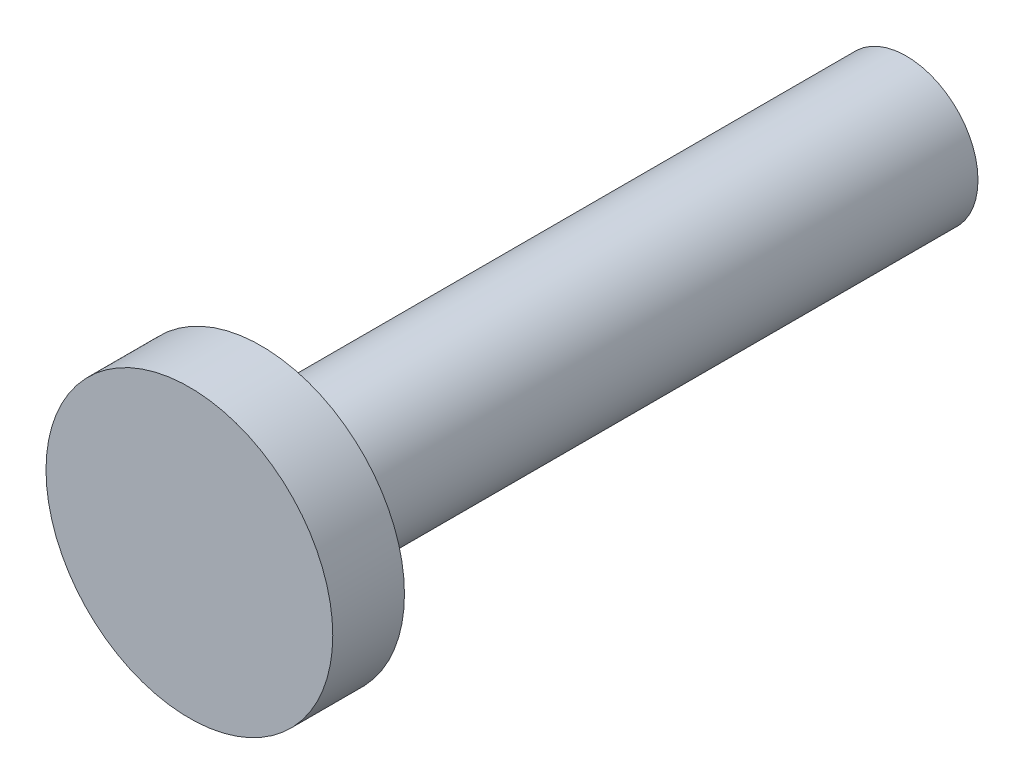
ISO-10303-21;
HEADER;
FILE_DESCRIPTION(('STEP AP214'),'2;1');
FILE_NAME('part.step','',(''),(''),'','','');
FILE_SCHEMA(('AUTOMOTIVE_DESIGN { 1 0 10303 214 1 1 1 1 }'));
ENDSEC;
DATA;
#1=APPLICATION_CONTEXT('core data for automotive mechanical design processes');
#2=APPLICATION_PROTOCOL_DEFINITION('international standard','automotive_design',2000,#1);
#3=PRODUCT_CONTEXT('',#1,'mechanical');
#4=PRODUCT('Part','Part','',(#3));
#5=PRODUCT_RELATED_PRODUCT_CATEGORY('part','',(#4));
#6=PRODUCT_DEFINITION_FORMATION('','',#4);
#7=PRODUCT_DEFINITION_CONTEXT('part definition',#1,'design');
#8=PRODUCT_DEFINITION('design','',#6,#7);
#9=PRODUCT_DEFINITION_SHAPE('','',#8);
#10=(LENGTH_UNIT() NAMED_UNIT(*) SI_UNIT(.MILLI.,.METRE.));
#11=(NAMED_UNIT(*) PLANE_ANGLE_UNIT() SI_UNIT($,.RADIAN.));
#12=(NAMED_UNIT(*) SI_UNIT($,.STERADIAN.) SOLID_ANGLE_UNIT());
#13=UNCERTAINTY_MEASURE_WITH_UNIT(LENGTH_MEASURE(1.E-05),#10,'distance_accuracy_value','');
#14=(GEOMETRIC_REPRESENTATION_CONTEXT(3) GLOBAL_UNCERTAINTY_ASSIGNED_CONTEXT((#13)) GLOBAL_UNIT_ASSIGNED_CONTEXT((#10,
#11,#12)) REPRESENTATION_CONTEXT('',''));
#15=CARTESIAN_POINT('',(0.,0.,0.));
#16=DIRECTION('',(0.,0.,1.));
#17=DIRECTION('',(1.,0.,0.));
#18=AXIS2_PLACEMENT_3D('',#15,#16,#17);
#19=CARTESIAN_POINT('',(0.,0.,5.));
#20=DIRECTION('',(0.,0.,-1.));
#21=DIRECTION('',(-1.,0.,0.));
#22=AXIS2_PLACEMENT_3D('',#19,#20,#21);
#23=CYLINDRICAL_SURFACE('',#22,10.);
#24=CARTESIAN_POINT('',(0.,0.,5.));
#25=DIRECTION('',(0.,0.,1.));
#26=DIRECTION('',(1.,0.,0.));
#27=AXIS2_PLACEMENT_3D('',#24,#25,#26);
#28=CIRCLE('',#27,10.);
#29=CARTESIAN_POINT('',(10.,0.,5.));
#30=VERTEX_POINT('',#29);
#31=EDGE_CURVE('E38',#30,#30,#28,.T.);
#32=ORIENTED_EDGE('',*,*,#31,.F.);
#33=EDGE_LOOP('',(#32));
#34=FACE_BOUND('',#33,.T.);
#35=CARTESIAN_POINT('',(0.,0.,0.));
#36=DIRECTION('',(0.,0.,1.));
#37=DIRECTION('',(1.,0.,0.));
#38=AXIS2_PLACEMENT_3D('',#35,#36,#37);
#39=CIRCLE('',#38,10.);
#40=CARTESIAN_POINT('',(10.,0.,0.));
#41=VERTEX_POINT('',#40);
#42=EDGE_CURVE('E34',#41,#41,#39,.T.);
#43=ORIENTED_EDGE('',*,*,#42,.T.);
#44=EDGE_LOOP('',(#43));
#45=FACE_BOUND('',#44,.T.);
#46=ADVANCED_FACE('F31',(#34,#45),#23,.T.);
#47=CARTESIAN_POINT('',(0.,0.,5.));
#48=DIRECTION('',(0.,0.,1.));
#49=DIRECTION('',(1.,0.,0.));
#50=AXIS2_PLACEMENT_3D('',#47,#48,#49);
#51=PLANE('',#50);
#52=ORIENTED_EDGE('',*,*,#31,.T.);
#53=EDGE_LOOP('',(#52));
#54=FACE_BOUND('',#53,.T.);
#55=ADVANCED_FACE('F55',(#54),#51,.T.);
#56=CARTESIAN_POINT('',(0.,0.,0.));
#57=DIRECTION('',(0.,0.,1.));
#58=DIRECTION('',(1.,0.,0.));
#59=AXIS2_PLACEMENT_3D('',#56,#57,#58);
#60=PLANE('',#59);
#61=CARTESIAN_POINT('',(0.,0.,0.));
#62=DIRECTION('',(0.,0.,-1.));
#63=DIRECTION('',(-1.,0.,0.));
#64=AXIS2_PLACEMENT_3D('',#61,#62,#63);
#65=CIRCLE('',#64,5.);
#66=CARTESIAN_POINT('',(5.,0.,0.));
#67=VERTEX_POINT('',#66);
#68=EDGE_CURVE('E10',#67,#67,#65,.T.);
#69=ORIENTED_EDGE('',*,*,#68,.F.);
#70=EDGE_LOOP('',(#69));
#71=FACE_BOUND('',#70,.T.);
#72=ORIENTED_EDGE('',*,*,#42,.F.);
#73=EDGE_LOOP('',(#72));
#74=FACE_BOUND('',#73,.T.);
#75=ADVANCED_FACE('F52',(#71,#74),#60,.F.);
#76=CARTESIAN_POINT('',(0.,0.,-45.));
#77=DIRECTION('',(0.,0.,1.));
#78=DIRECTION('',(1.,0.,0.));
#79=AXIS2_PLACEMENT_3D('',#76,#77,#78);
#80=CYLINDRICAL_SURFACE('',#79,5.);
#81=CARTESIAN_POINT('',(0.,0.,-45.));
#82=DIRECTION('',(0.,0.,-1.));
#83=DIRECTION('',(-1.,0.,0.));
#84=AXIS2_PLACEMENT_3D('',#81,#82,#83);
#85=CIRCLE('',#84,5.);
#86=CARTESIAN_POINT('',(5.,0.,-45.));
#87=VERTEX_POINT('',#86);
#88=EDGE_CURVE('E44',#87,#87,#85,.T.);
#89=CARTESIAN_POINT('',(5.,0.,-45.));
#90=CARTESIAN_POINT('',(5.,0.,-44.53125));
#91=CARTESIAN_POINT('',(5.,0.,-44.0625));
#92=CARTESIAN_POINT('',(5.,0.,-43.125));
#93=CARTESIAN_POINT('',(5.,0.,-42.65625));
#94=CARTESIAN_POINT('',(5.,0.,-41.71875));
#95=CARTESIAN_POINT('',(5.,0.,-41.25));
#96=CARTESIAN_POINT('',(5.,0.,-40.3125));
#97=CARTESIAN_POINT('',(5.,0.,-39.84375));
#98=CARTESIAN_POINT('',(5.,0.,-38.90625));
#99=CARTESIAN_POINT('',(5.,0.,-38.4375));
#100=CARTESIAN_POINT('',(5.,0.,-37.5));
#101=CARTESIAN_POINT('',(5.,0.,-37.03125));
#102=CARTESIAN_POINT('',(5.,0.,-36.09375));
#103=CARTESIAN_POINT('',(5.,0.,-35.625));
#104=CARTESIAN_POINT('',(5.,0.,-34.6875));
#105=CARTESIAN_POINT('',(5.,0.,-34.21875));
#106=CARTESIAN_POINT('',(5.,0.,-33.28125));
#107=CARTESIAN_POINT('',(5.,0.,-32.8125));
#108=CARTESIAN_POINT('',(5.,0.,-31.875));
#109=CARTESIAN_POINT('',(5.,0.,-31.40625));
#110=CARTESIAN_POINT('',(5.,0.,-30.46875));
#111=CARTESIAN_POINT('',(5.,0.,-30.));
#112=CARTESIAN_POINT('',(5.,0.,-29.0625));
#113=CARTESIAN_POINT('',(5.,0.,-28.59375));
#114=CARTESIAN_POINT('',(5.,0.,-27.65625));
#115=CARTESIAN_POINT('',(5.,0.,-27.1875));
#116=CARTESIAN_POINT('',(5.,0.,-26.25));
#117=CARTESIAN_POINT('',(5.,0.,-25.78125));
#118=CARTESIAN_POINT('',(5.,0.,-24.84375));
#119=CARTESIAN_POINT('',(5.,0.,-24.375));
#120=CARTESIAN_POINT('',(5.,0.,-23.4375));
#121=CARTESIAN_POINT('',(5.,0.,-22.96875));
#122=CARTESIAN_POINT('',(5.,0.,-22.03125));
#123=CARTESIAN_POINT('',(5.,0.,-21.5625));
#124=CARTESIAN_POINT('',(5.,0.,-20.625));
#125=CARTESIAN_POINT('',(5.,0.,-20.15625));
#126=CARTESIAN_POINT('',(5.,0.,-19.21875));
#127=CARTESIAN_POINT('',(5.,0.,-18.75));
#128=CARTESIAN_POINT('',(5.,0.,-17.8125));
#129=CARTESIAN_POINT('',(5.,0.,-17.34375));
#130=CARTESIAN_POINT('',(5.,0.,-16.40625));
#131=CARTESIAN_POINT('',(5.,0.,-15.9375));
#132=CARTESIAN_POINT('',(5.,0.,-15.));
#133=CARTESIAN_POINT('',(5.,0.,-14.53125));
#134=CARTESIAN_POINT('',(5.,0.,-13.59375));
#135=CARTESIAN_POINT('',(5.,0.,-13.125));
#136=CARTESIAN_POINT('',(5.,0.,-12.1875));
#137=CARTESIAN_POINT('',(5.,0.,-11.71875));
#138=CARTESIAN_POINT('',(5.,0.,-10.78125));
#139=CARTESIAN_POINT('',(5.,0.,-10.3125));
#140=CARTESIAN_POINT('',(5.,0.,-9.375));
#141=CARTESIAN_POINT('',(5.,0.,-8.90625));
#142=CARTESIAN_POINT('',(5.,0.,-7.96875));
#143=CARTESIAN_POINT('',(5.,0.,-7.5));
#144=CARTESIAN_POINT('',(5.,0.,-6.5625));
#145=CARTESIAN_POINT('',(5.,0.,-6.09375));
#146=CARTESIAN_POINT('',(5.,0.,-5.15625));
#147=CARTESIAN_POINT('',(5.,0.,-4.6875));
#148=CARTESIAN_POINT('',(5.,0.,-3.75));
#149=CARTESIAN_POINT('',(5.,0.,-3.28125));
#150=CARTESIAN_POINT('',(5.,0.,-2.34375));
#151=CARTESIAN_POINT('',(5.,0.,-1.875));
#152=CARTESIAN_POINT('',(5.,0.,-0.937499999999999));
#153=CARTESIAN_POINT('',(5.,0.,-0.46875));
#154=CARTESIAN_POINT('',(5.,0.,0.));
#155=B_SPLINE_CURVE_WITH_KNOTS('',3,(#89,#90,#91,#92,#93,#94,#95,#96,#97,#98,#99,#100,#101,#102,
#103,#104,#105,#106,#107,#108,#109,#110,#111,#112,#113,#114,#115,#116,#117,#118,#119,#120,#121,
#122,#123,#124,#125,#126,#127,#128,#129,#130,#131,#132,#133,#134,#135,#136,#137,#138,#139,#140,
#141,#142,#143,#144,#145,#146,#147,#148,#149,#150,#151,#152,#153,#154),.UNSPECIFIED.,.F.,.F.,(4,
2,2,2,2,2,2,2,2,2,2,2,2,2,2,2,2,2,2,2,2,2,2,2,2,2,2,2,2,2,2,2,4),(0.,1.40625,2.8125,4.21875,
5.62500000000001,7.03125,8.43750000000001,9.84375000000001,11.25,12.65625,14.0625,15.46875,
16.875,18.28125,19.6875,21.09375,22.5,23.90625,25.3125,26.71875,28.125,29.53125,30.9375,
32.34375,33.75,35.15625,36.5625,37.96875,39.375,40.78125,42.1875,43.59375,45.),.UNSPECIFIED.);
#156=EDGE_CURVE('BSEAM54',#87,#67,#155,.T.);
#157=ORIENTED_EDGE('',*,*,#88,.F.);
#158=ORIENTED_EDGE('',*,*,#68,.T.);
#159=ORIENTED_EDGE('',*,*,#156,.T.);
#160=ORIENTED_EDGE('',*,*,#156,.F.);
#161=EDGE_LOOP('',(#157,#159,#158,#160));
#162=FACE_BOUND('',#161,.T.);
#163=ADVANCED_FACE('F54',(#162),#80,.T.);
#164=CARTESIAN_POINT('',(0.,0.,-45.));
#165=DIRECTION('',(0.,0.,-1.));
#166=DIRECTION('',(-1.,0.,0.));
#167=AXIS2_PLACEMENT_3D('',#164,#165,#166);
#168=PLANE('',#167);
#169=ORIENTED_EDGE('',*,*,#88,.T.);
#170=EDGE_LOOP('',(#169));
#171=FACE_BOUND('',#170,.T.);
#172=ADVANCED_FACE('F61',(#171),#168,.T.);
#173=CLOSED_SHELL('',(#46,#55,#75,#163,#172));
#174=MANIFOLD_SOLID_BREP('B2',#173);
#175=ADVANCED_BREP_SHAPE_REPRESENTATION('',(#18,#174),#14);
#176=SHAPE_DEFINITION_REPRESENTATION(#9,#175);
ENDSEC;
END-ISO-10303-21;
